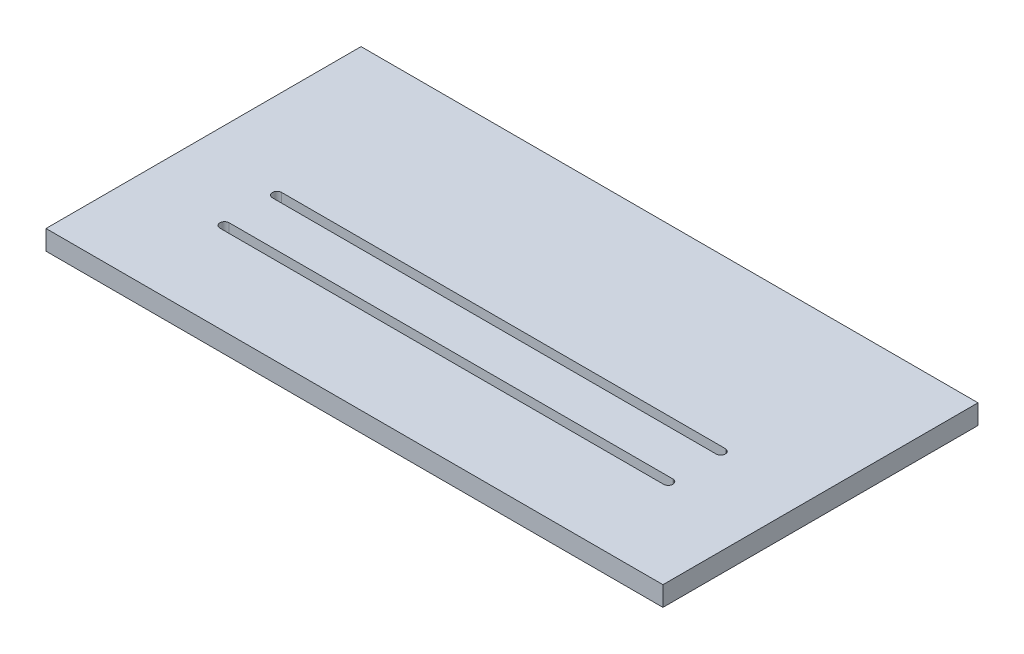
ISO-10303-21;
HEADER;
FILE_DESCRIPTION(('STEP AP214'),'2;1');
FILE_NAME('part.step','',(''),(''),'','','');
FILE_SCHEMA(('AUTOMOTIVE_DESIGN { 1 0 10303 214 1 1 1 1 }'));
ENDSEC;
DATA;
#1=APPLICATION_CONTEXT('core data for automotive mechanical design processes');
#2=APPLICATION_PROTOCOL_DEFINITION('international standard','automotive_design',2000,#1);
#3=PRODUCT_CONTEXT('',#1,'mechanical');
#4=PRODUCT('Part','Part','',(#3));
#5=PRODUCT_RELATED_PRODUCT_CATEGORY('part','',(#4));
#6=PRODUCT_DEFINITION_FORMATION('','',#4);
#7=PRODUCT_DEFINITION_CONTEXT('part definition',#1,'design');
#8=PRODUCT_DEFINITION('design','',#6,#7);
#9=PRODUCT_DEFINITION_SHAPE('','',#8);
#10=(LENGTH_UNIT() NAMED_UNIT(*) SI_UNIT(.MILLI.,.METRE.));
#11=(NAMED_UNIT(*) PLANE_ANGLE_UNIT() SI_UNIT($,.RADIAN.));
#12=(NAMED_UNIT(*) SI_UNIT($,.STERADIAN.) SOLID_ANGLE_UNIT());
#13=UNCERTAINTY_MEASURE_WITH_UNIT(LENGTH_MEASURE(1.E-05),#10,'distance_accuracy_value','');
#14=(GEOMETRIC_REPRESENTATION_CONTEXT(3) GLOBAL_UNCERTAINTY_ASSIGNED_CONTEXT((#13)) GLOBAL_UNIT_ASSIGNED_CONTEXT((#10,
#11,#12)) REPRESENTATION_CONTEXT('',''));
#15=CARTESIAN_POINT('',(0.,0.,0.));
#16=DIRECTION('',(0.,0.,1.));
#17=DIRECTION('',(1.,0.,0.));
#18=AXIS2_PLACEMENT_3D('',#15,#16,#17);
#19=CARTESIAN_POINT('',(0.,4.7625,76.2));
#20=DIRECTION('',(0.,0.,-1.));
#21=DIRECTION('',(-1.,0.,0.));
#22=AXIS2_PLACEMENT_3D('',#19,#20,#21);
#23=PLANE('',#22);
#24=DIRECTION('',(1.,0.,0.));
#25=VECTOR('',#24,1.);
#26=CARTESIAN_POINT('',(0.,-4.7625,76.2));
#27=LINE('',#26,#25);
#28=CARTESIAN_POINT('',(-149.225,-4.7625,76.2));
#29=VERTEX_POINT('',#28);
#30=CARTESIAN_POINT('',(149.225,-4.7625,76.2));
#31=VERTEX_POINT('',#30);
#32=EDGE_CURVE('E178',#29,#31,#27,.T.);
#33=ORIENTED_EDGE('',*,*,#32,.T.);
#34=DIRECTION('',(0.,-1.,0.));
#35=VECTOR('',#34,1.);
#36=CARTESIAN_POINT('',(149.225,4.7625,76.2));
#37=LINE('',#36,#35);
#38=CARTESIAN_POINT('',(149.225,4.7625,76.2));
#39=VERTEX_POINT('',#38);
#40=EDGE_CURVE('E11',#39,#31,#37,.T.);
#41=ORIENTED_EDGE('',*,*,#40,.F.);
#42=DIRECTION('',(1.,0.,0.));
#43=VECTOR('',#42,1.);
#44=CARTESIAN_POINT('',(0.,4.7625,76.2));
#45=LINE('',#44,#43);
#46=CARTESIAN_POINT('',(-149.225,4.7625,76.2));
#47=VERTEX_POINT('',#46);
#48=EDGE_CURVE('E225',#47,#39,#45,.T.);
#49=ORIENTED_EDGE('',*,*,#48,.F.);
#50=DIRECTION('',(0.,-1.,0.));
#51=VECTOR('',#50,1.);
#52=CARTESIAN_POINT('',(-149.225,4.7625,76.2));
#53=LINE('',#52,#51);
#54=EDGE_CURVE('E241',#47,#29,#53,.T.);
#55=ORIENTED_EDGE('',*,*,#54,.T.);
#56=EDGE_LOOP('',(#33,#41,#49,#55));
#57=FACE_BOUND('',#56,.T.);
#58=ADVANCED_FACE('F41',(#57),#23,.F.);
#59=CARTESIAN_POINT('',(149.225,4.7625,0.));
#60=DIRECTION('',(-1.,0.,0.));
#61=DIRECTION('',(0.,0.,1.));
#62=AXIS2_PLACEMENT_3D('',#59,#60,#61);
#63=PLANE('',#62);
#64=DIRECTION('',(0.,0.,-1.));
#65=VECTOR('',#64,1.);
#66=CARTESIAN_POINT('',(149.225,-4.7625,0.));
#67=LINE('',#66,#65);
#68=CARTESIAN_POINT('',(149.225,-4.7625,-76.2));
#69=VERTEX_POINT('',#68);
#70=EDGE_CURVE('E245',#31,#69,#67,.T.);
#71=ORIENTED_EDGE('',*,*,#70,.T.);
#72=DIRECTION('',(0.,-1.,0.));
#73=VECTOR('',#72,1.);
#74=CARTESIAN_POINT('',(149.225,4.7625,-76.2));
#75=LINE('',#74,#73);
#76=CARTESIAN_POINT('',(149.225,4.7625,-76.2));
#77=VERTEX_POINT('',#76);
#78=EDGE_CURVE('E49',#77,#69,#75,.T.);
#79=ORIENTED_EDGE('',*,*,#78,.F.);
#80=DIRECTION('',(0.,0.,-1.));
#81=VECTOR('',#80,1.);
#82=CARTESIAN_POINT('',(149.225,4.7625,0.));
#83=LINE('',#82,#81);
#84=EDGE_CURVE('E229',#39,#77,#83,.T.);
#85=ORIENTED_EDGE('',*,*,#84,.F.);
#86=ORIENTED_EDGE('',*,*,#40,.T.);
#87=EDGE_LOOP('',(#71,#79,#85,#86));
#88=FACE_BOUND('',#87,.T.);
#89=ADVANCED_FACE('F267',(#88),#63,.F.);
#90=CARTESIAN_POINT('',(0.,4.7625,-76.2));
#91=DIRECTION('',(0.,0.,-1.));
#92=DIRECTION('',(-1.,0.,0.));
#93=AXIS2_PLACEMENT_3D('',#90,#91,#92);
#94=PLANE('',#93);
#95=DIRECTION('',(1.,0.,0.));
#96=VECTOR('',#95,1.);
#97=CARTESIAN_POINT('',(0.,-4.7625,-76.2));
#98=LINE('',#97,#96);
#99=CARTESIAN_POINT('',(-149.225,-4.7625,-76.2));
#100=VERTEX_POINT('',#99);
#101=EDGE_CURVE('E249',#100,#69,#98,.T.);
#102=ORIENTED_EDGE('',*,*,#101,.F.);
#103=DIRECTION('',(0.,-1.,0.));
#104=VECTOR('',#103,1.);
#105=CARTESIAN_POINT('',(-149.225,4.7625,-76.2));
#106=LINE('',#105,#104);
#107=CARTESIAN_POINT('',(-149.225,4.7625,-76.2));
#108=VERTEX_POINT('',#107);
#109=EDGE_CURVE('E258',#108,#100,#106,.T.);
#110=ORIENTED_EDGE('',*,*,#109,.F.);
#111=DIRECTION('',(1.,0.,0.));
#112=VECTOR('',#111,1.);
#113=CARTESIAN_POINT('',(0.,4.7625,-76.2));
#114=LINE('',#113,#112);
#115=EDGE_CURVE('E233',#108,#77,#114,.T.);
#116=ORIENTED_EDGE('',*,*,#115,.T.);
#117=ORIENTED_EDGE('',*,*,#78,.T.);
#118=EDGE_LOOP('',(#102,#110,#116,#117));
#119=FACE_BOUND('',#118,.T.);
#120=ADVANCED_FACE('F264',(#119),#94,.T.);
#121=CARTESIAN_POINT('',(-149.225,4.7625,0.));
#122=DIRECTION('',(-1.,0.,0.));
#123=DIRECTION('',(0.,0.,1.));
#124=AXIS2_PLACEMENT_3D('',#121,#122,#123);
#125=PLANE('',#124);
#126=DIRECTION('',(0.,0.,-1.));
#127=VECTOR('',#126,1.);
#128=CARTESIAN_POINT('',(-149.225,-4.7625,0.));
#129=LINE('',#128,#127);
#130=EDGE_CURVE('E230',#29,#100,#129,.T.);
#131=ORIENTED_EDGE('',*,*,#130,.F.);
#132=ORIENTED_EDGE('',*,*,#54,.F.);
#133=DIRECTION('',(0.,0.,-1.));
#134=VECTOR('',#133,1.);
#135=CARTESIAN_POINT('',(-149.225,4.7625,0.));
#136=LINE('',#135,#134);
#137=EDGE_CURVE('E237',#47,#108,#136,.T.);
#138=ORIENTED_EDGE('',*,*,#137,.T.);
#139=ORIENTED_EDGE('',*,*,#109,.T.);
#140=EDGE_LOOP('',(#131,#132,#138,#139));
#141=FACE_BOUND('',#140,.T.);
#142=ADVANCED_FACE('F274',(#141),#125,.T.);
#143=CARTESIAN_POINT('',(0.,4.7625,0.));
#144=DIRECTION('',(0.,1.,0.));
#145=DIRECTION('',(0.,0.,1.));
#146=AXIS2_PLACEMENT_3D('',#143,#144,#145);
#147=PLANE('',#146);
#148=CARTESIAN_POINT('',(-107.315,4.7625,31.75));
#149=DIRECTION('',(0.,-1.,0.));
#150=DIRECTION('',(0.,0.,-1.));
#151=AXIS2_PLACEMENT_3D('',#148,#149,#150);
#152=CIRCLE('',#151,2.24789999999999);
#153=CARTESIAN_POINT('',(-107.315,4.7625,33.9979));
#154=VERTEX_POINT('',#153);
#155=CARTESIAN_POINT('',(-107.315,4.7625,29.5021));
#156=VERTEX_POINT('',#155);
#157=EDGE_CURVE('E134',#154,#156,#152,.T.);
#158=ORIENTED_EDGE('',*,*,#157,.T.);
#159=DIRECTION('',(1.,0.,0.));
#160=VECTOR('',#159,1.);
#161=CARTESIAN_POINT('',(-107.315,4.7625,29.5021));
#162=LINE('',#161,#160);
#163=CARTESIAN_POINT('',(107.315,4.7625,29.5021));
#164=VERTEX_POINT('',#163);
#165=EDGE_CURVE('E146',#156,#164,#162,.T.);
#166=ORIENTED_EDGE('',*,*,#165,.T.);
#167=CARTESIAN_POINT('',(107.315,4.7625,31.75));
#168=DIRECTION('',(0.,-1.,0.));
#169=DIRECTION('',(0.,0.,-1.));
#170=AXIS2_PLACEMENT_3D('',#167,#168,#169);
#171=CIRCLE('',#170,2.24789999999999);
#172=CARTESIAN_POINT('',(107.315,4.7625,33.9979));
#173=VERTEX_POINT('',#172);
#174=EDGE_CURVE('E56',#164,#173,#171,.T.);
#175=ORIENTED_EDGE('',*,*,#174,.T.);
#176=DIRECTION('',(-1.,0.,0.));
#177=VECTOR('',#176,1.);
#178=CARTESIAN_POINT('',(-107.315,4.7625,33.9979));
#179=LINE('',#178,#177);
#180=EDGE_CURVE('E143',#173,#154,#179,.T.);
#181=ORIENTED_EDGE('',*,*,#180,.T.);
#182=EDGE_LOOP('',(#158,#166,#175,#181));
#183=FACE_BOUND('',#182,.T.);
#184=CARTESIAN_POINT('',(-107.315,4.7625,6.35000000000003));
#185=DIRECTION('',(0.,-1.,0.));
#186=DIRECTION('',(0.,0.,-1.));
#187=AXIS2_PLACEMENT_3D('',#184,#185,#186);
#188=CIRCLE('',#187,2.2479);
#189=CARTESIAN_POINT('',(-107.315,4.7625,8.59790000000003));
#190=VERTEX_POINT('',#189);
#191=CARTESIAN_POINT('',(-107.315,4.7625,4.10210000000003));
#192=VERTEX_POINT('',#191);
#193=EDGE_CURVE('E184',#190,#192,#188,.T.);
#194=ORIENTED_EDGE('',*,*,#193,.T.);
#195=DIRECTION('',(1.,0.,0.));
#196=VECTOR('',#195,1.);
#197=CARTESIAN_POINT('',(-107.315,4.7625,4.10210000000003));
#198=LINE('',#197,#196);
#199=CARTESIAN_POINT('',(107.315,4.7625,4.10210000000003));
#200=VERTEX_POINT('',#199);
#201=EDGE_CURVE('E188',#192,#200,#198,.T.);
#202=ORIENTED_EDGE('',*,*,#201,.T.);
#203=CARTESIAN_POINT('',(107.315,4.7625,6.35000000000003));
#204=DIRECTION('',(0.,-1.,0.));
#205=DIRECTION('',(0.,0.,-1.));
#206=AXIS2_PLACEMENT_3D('',#203,#204,#205);
#207=CIRCLE('',#206,2.2479);
#208=CARTESIAN_POINT('',(107.315,4.7625,8.59790000000003));
#209=VERTEX_POINT('',#208);
#210=EDGE_CURVE('E64',#200,#209,#207,.T.);
#211=ORIENTED_EDGE('',*,*,#210,.T.);
#212=DIRECTION('',(-1.,0.,0.));
#213=VECTOR('',#212,1.);
#214=CARTESIAN_POINT('',(-107.315,4.7625,8.59790000000003));
#215=LINE('',#214,#213);
#216=EDGE_CURVE('E195',#209,#190,#215,.T.);
#217=ORIENTED_EDGE('',*,*,#216,.T.);
#218=EDGE_LOOP('',(#194,#202,#211,#217));
#219=FACE_BOUND('',#218,.T.);
#220=ORIENTED_EDGE('',*,*,#48,.T.);
#221=ORIENTED_EDGE('',*,*,#84,.T.);
#222=ORIENTED_EDGE('',*,*,#115,.F.);
#223=ORIENTED_EDGE('',*,*,#137,.F.);
#224=EDGE_LOOP('',(#220,#221,#222,#223));
#225=FACE_BOUND('',#224,.T.);
#226=ADVANCED_FACE('F151',(#183,#219,#225),#147,.T.);
#227=CARTESIAN_POINT('',(0.,-4.7625,0.));
#228=DIRECTION('',(0.,1.,0.));
#229=DIRECTION('',(0.,0.,1.));
#230=AXIS2_PLACEMENT_3D('',#227,#228,#229);
#231=PLANE('',#230);
#232=DIRECTION('',(1.,0.,0.));
#233=VECTOR('',#232,1.);
#234=CARTESIAN_POINT('',(-107.315,-4.7625,29.5021));
#235=LINE('',#234,#233);
#236=CARTESIAN_POINT('',(-107.315,-4.7625,29.5021));
#237=VERTEX_POINT('',#236);
#238=CARTESIAN_POINT('',(107.315,-4.7625,29.5021));
#239=VERTEX_POINT('',#238);
#240=EDGE_CURVE('E168',#237,#239,#235,.T.);
#241=ORIENTED_EDGE('',*,*,#240,.F.);
#242=CARTESIAN_POINT('',(-107.315,-4.7625,31.75));
#243=DIRECTION('',(0.,-1.,0.));
#244=DIRECTION('',(0.,0.,-1.));
#245=AXIS2_PLACEMENT_3D('',#242,#243,#244);
#246=CIRCLE('',#245,2.24789999999999);
#247=CARTESIAN_POINT('',(-107.315,-4.7625,33.9979));
#248=VERTEX_POINT('',#247);
#249=EDGE_CURVE('E137',#248,#237,#246,.T.);
#250=ORIENTED_EDGE('',*,*,#249,.F.);
#251=DIRECTION('',(-1.,0.,0.));
#252=VECTOR('',#251,1.);
#253=CARTESIAN_POINT('',(-107.315,-4.7625,33.9979));
#254=LINE('',#253,#252);
#255=CARTESIAN_POINT('',(107.315,-4.7625,33.9979));
#256=VERTEX_POINT('',#255);
#257=EDGE_CURVE('E155',#256,#248,#254,.T.);
#258=ORIENTED_EDGE('',*,*,#257,.F.);
#259=CARTESIAN_POINT('',(107.315,-4.7625,31.75));
#260=DIRECTION('',(0.,-1.,0.));
#261=DIRECTION('',(0.,0.,-1.));
#262=AXIS2_PLACEMENT_3D('',#259,#260,#261);
#263=CIRCLE('',#262,2.24789999999999);
#264=EDGE_CURVE('E159',#239,#256,#263,.T.);
#265=ORIENTED_EDGE('',*,*,#264,.F.);
#266=EDGE_LOOP('',(#241,#250,#258,#265));
#267=FACE_BOUND('',#266,.T.);
#268=DIRECTION('',(1.,0.,0.));
#269=VECTOR('',#268,1.);
#270=CARTESIAN_POINT('',(-107.315,-4.7625,4.10210000000003));
#271=LINE('',#270,#269);
#272=CARTESIAN_POINT('',(-107.315,-4.7625,4.10210000000003));
#273=VERTEX_POINT('',#272);
#274=CARTESIAN_POINT('',(107.315,-4.7625,4.10210000000003));
#275=VERTEX_POINT('',#274);
#276=EDGE_CURVE('E203',#273,#275,#271,.T.);
#277=ORIENTED_EDGE('',*,*,#276,.F.);
#278=CARTESIAN_POINT('',(-107.315,-4.7625,6.35000000000003));
#279=DIRECTION('',(0.,-1.,0.));
#280=DIRECTION('',(0.,0.,-1.));
#281=AXIS2_PLACEMENT_3D('',#278,#279,#280);
#282=CIRCLE('',#281,2.2479);
#283=CARTESIAN_POINT('',(-107.315,-4.7625,8.59790000000003));
#284=VERTEX_POINT('',#283);
#285=EDGE_CURVE('E200',#284,#273,#282,.T.);
#286=ORIENTED_EDGE('',*,*,#285,.F.);
#287=DIRECTION('',(-1.,0.,0.));
#288=VECTOR('',#287,1.);
#289=CARTESIAN_POINT('',(-107.315,-4.7625,8.59790000000003));
#290=LINE('',#289,#288);
#291=CARTESIAN_POINT('',(107.315,-4.7625,8.59790000000003));
#292=VERTEX_POINT('',#291);
#293=EDGE_CURVE('E189',#292,#284,#290,.T.);
#294=ORIENTED_EDGE('',*,*,#293,.F.);
#295=CARTESIAN_POINT('',(107.315,-4.7625,6.35000000000003));
#296=DIRECTION('',(0.,-1.,0.));
#297=DIRECTION('',(0.,0.,-1.));
#298=AXIS2_PLACEMENT_3D('',#295,#296,#297);
#299=CIRCLE('',#298,2.2479);
#300=EDGE_CURVE('E207',#275,#292,#299,.T.);
#301=ORIENTED_EDGE('',*,*,#300,.F.);
#302=EDGE_LOOP('',(#277,#286,#294,#301));
#303=FACE_BOUND('',#302,.T.);
#304=ORIENTED_EDGE('',*,*,#32,.F.);
#305=ORIENTED_EDGE('',*,*,#130,.T.);
#306=ORIENTED_EDGE('',*,*,#101,.T.);
#307=ORIENTED_EDGE('',*,*,#70,.F.);
#308=EDGE_LOOP('',(#304,#305,#306,#307));
#309=FACE_BOUND('',#308,.T.);
#310=ADVANCED_FACE('F271',(#267,#303,#309),#231,.F.);
#311=CARTESIAN_POINT('',(-107.315,4.7625,6.35000000000003));
#312=DIRECTION('',(0.,-1.,0.));
#313=DIRECTION('',(0.,0.,-1.));
#314=AXIS2_PLACEMENT_3D('',#311,#312,#313);
#315=CYLINDRICAL_SURFACE('',#314,2.2479);
#316=ORIENTED_EDGE('',*,*,#285,.T.);
#317=DIRECTION('',(0.,-1.,0.));
#318=VECTOR('',#317,1.);
#319=CARTESIAN_POINT('',(-107.315,4.7625,4.10210000000003));
#320=LINE('',#319,#318);
#321=EDGE_CURVE('E199',#192,#273,#320,.T.);
#322=ORIENTED_EDGE('',*,*,#321,.F.);
#323=ORIENTED_EDGE('',*,*,#193,.F.);
#324=DIRECTION('',(0.,-1.,0.));
#325=VECTOR('',#324,1.);
#326=CARTESIAN_POINT('',(-107.315,4.7625,8.59790000000003));
#327=LINE('',#326,#325);
#328=EDGE_CURVE('E169',#190,#284,#327,.T.);
#329=ORIENTED_EDGE('',*,*,#328,.T.);
#330=EDGE_LOOP('',(#316,#322,#323,#329));
#331=FACE_BOUND('',#330,.T.);
#332=ADVANCED_FACE('F292',(#331),#315,.F.);
#333=CARTESIAN_POINT('',(-107.315,4.7625,8.59790000000003));
#334=DIRECTION('',(0.,0.,1.));
#335=DIRECTION('',(1.,0.,0.));
#336=AXIS2_PLACEMENT_3D('',#333,#334,#335);
#337=PLANE('',#336);
#338=ORIENTED_EDGE('',*,*,#293,.T.);
#339=ORIENTED_EDGE('',*,*,#328,.F.);
#340=ORIENTED_EDGE('',*,*,#216,.F.);
#341=DIRECTION('',(0.,-1.,0.));
#342=VECTOR('',#341,1.);
#343=CARTESIAN_POINT('',(107.315,4.7625,8.59790000000003));
#344=LINE('',#343,#342);
#345=EDGE_CURVE('E216',#209,#292,#344,.T.);
#346=ORIENTED_EDGE('',*,*,#345,.T.);
#347=EDGE_LOOP('',(#338,#339,#340,#346));
#348=FACE_BOUND('',#347,.T.);
#349=ADVANCED_FACE('F298',(#348),#337,.F.);
#350=CARTESIAN_POINT('',(107.315,4.7625,6.35000000000003));
#351=DIRECTION('',(0.,-1.,0.));
#352=DIRECTION('',(0.,0.,-1.));
#353=AXIS2_PLACEMENT_3D('',#350,#351,#352);
#354=CYLINDRICAL_SURFACE('',#353,2.2479);
#355=ORIENTED_EDGE('',*,*,#300,.T.);
#356=ORIENTED_EDGE('',*,*,#345,.F.);
#357=ORIENTED_EDGE('',*,*,#210,.F.);
#358=DIRECTION('',(0.,-1.,0.));
#359=VECTOR('',#358,1.);
#360=CARTESIAN_POINT('',(107.315,4.7625,4.10210000000003));
#361=LINE('',#360,#359);
#362=EDGE_CURVE('E219',#200,#275,#361,.T.);
#363=ORIENTED_EDGE('',*,*,#362,.T.);
#364=EDGE_LOOP('',(#355,#356,#357,#363));
#365=FACE_BOUND('',#364,.T.);
#366=ADVANCED_FACE('F303',(#365),#354,.F.);
#367=CARTESIAN_POINT('',(-107.315,4.7625,4.10210000000003));
#368=DIRECTION('',(0.,0.,-1.));
#369=DIRECTION('',(-1.,0.,0.));
#370=AXIS2_PLACEMENT_3D('',#367,#368,#369);
#371=PLANE('',#370);
#372=ORIENTED_EDGE('',*,*,#276,.T.);
#373=ORIENTED_EDGE('',*,*,#362,.F.);
#374=ORIENTED_EDGE('',*,*,#201,.F.);
#375=ORIENTED_EDGE('',*,*,#321,.T.);
#376=EDGE_LOOP('',(#372,#373,#374,#375));
#377=FACE_BOUND('',#376,.T.);
#378=ADVANCED_FACE('F300',(#377),#371,.F.);
#379=CARTESIAN_POINT('',(-107.315,4.7625,31.75));
#380=DIRECTION('',(0.,-1.,0.));
#381=DIRECTION('',(0.,0.,-1.));
#382=AXIS2_PLACEMENT_3D('',#379,#380,#381);
#383=CYLINDRICAL_SURFACE('',#382,2.24789999999999);
#384=ORIENTED_EDGE('',*,*,#249,.T.);
#385=DIRECTION('',(0.,-1.,0.));
#386=VECTOR('',#385,1.);
#387=CARTESIAN_POINT('',(-107.315,4.7625,29.5021));
#388=LINE('',#387,#386);
#389=EDGE_CURVE('E130',#156,#237,#388,.T.);
#390=ORIENTED_EDGE('',*,*,#389,.F.);
#391=ORIENTED_EDGE('',*,*,#157,.F.);
#392=DIRECTION('',(0.,-1.,0.));
#393=VECTOR('',#392,1.);
#394=CARTESIAN_POINT('',(-107.315,4.7625,33.9979));
#395=LINE('',#394,#393);
#396=EDGE_CURVE('E175',#154,#248,#395,.T.);
#397=ORIENTED_EDGE('',*,*,#396,.T.);
#398=EDGE_LOOP('',(#384,#390,#391,#397));
#399=FACE_BOUND('',#398,.T.);
#400=ADVANCED_FACE('F132',(#399),#383,.F.);
#401=CARTESIAN_POINT('',(-107.315,4.7625,33.9979));
#402=DIRECTION('',(0.,0.,1.));
#403=DIRECTION('',(1.,0.,0.));
#404=AXIS2_PLACEMENT_3D('',#401,#402,#403);
#405=PLANE('',#404);
#406=ORIENTED_EDGE('',*,*,#257,.T.);
#407=ORIENTED_EDGE('',*,*,#396,.F.);
#408=ORIENTED_EDGE('',*,*,#180,.F.);
#409=DIRECTION('',(0.,-1.,0.));
#410=VECTOR('',#409,1.);
#411=CARTESIAN_POINT('',(107.315,4.7625,33.9979));
#412=LINE('',#411,#410);
#413=EDGE_CURVE('E179',#173,#256,#412,.T.);
#414=ORIENTED_EDGE('',*,*,#413,.T.);
#415=EDGE_LOOP('',(#406,#407,#408,#414));
#416=FACE_BOUND('',#415,.T.);
#417=ADVANCED_FACE('F312',(#416),#405,.F.);
#418=CARTESIAN_POINT('',(107.315,4.7625,31.75));
#419=DIRECTION('',(0.,-1.,0.));
#420=DIRECTION('',(0.,0.,-1.));
#421=AXIS2_PLACEMENT_3D('',#418,#419,#420);
#422=CYLINDRICAL_SURFACE('',#421,2.24789999999999);
#423=ORIENTED_EDGE('',*,*,#264,.T.);
#424=ORIENTED_EDGE('',*,*,#413,.F.);
#425=ORIENTED_EDGE('',*,*,#174,.F.);
#426=DIRECTION('',(0.,-1.,0.));
#427=VECTOR('',#426,1.);
#428=CARTESIAN_POINT('',(107.315,4.7625,29.5021));
#429=LINE('',#428,#427);
#430=EDGE_CURVE('E142',#164,#239,#429,.T.);
#431=ORIENTED_EDGE('',*,*,#430,.T.);
#432=EDGE_LOOP('',(#423,#424,#425,#431));
#433=FACE_BOUND('',#432,.T.);
#434=ADVANCED_FACE('F315',(#433),#422,.F.);
#435=CARTESIAN_POINT('',(-107.315,4.7625,29.5021));
#436=DIRECTION('',(0.,0.,-1.));
#437=DIRECTION('',(-1.,0.,0.));
#438=AXIS2_PLACEMENT_3D('',#435,#436,#437);
#439=PLANE('',#438);
#440=ORIENTED_EDGE('',*,*,#240,.T.);
#441=ORIENTED_EDGE('',*,*,#430,.F.);
#442=ORIENTED_EDGE('',*,*,#165,.F.);
#443=ORIENTED_EDGE('',*,*,#389,.T.);
#444=EDGE_LOOP('',(#440,#441,#442,#443));
#445=FACE_BOUND('',#444,.T.);
#446=ADVANCED_FACE('F147',(#445),#439,.F.);
#447=CLOSED_SHELL('',(#58,#89,#120,#142,#226,#310,#332,#349,#366,#378,#400,#417,#434,#446));
#448=MANIFOLD_SOLID_BREP('B2',#447);
#449=ADVANCED_BREP_SHAPE_REPRESENTATION('',(#18,#448),#14);
#450=SHAPE_DEFINITION_REPRESENTATION(#9,#449);
ENDSEC;
END-ISO-10303-21;
